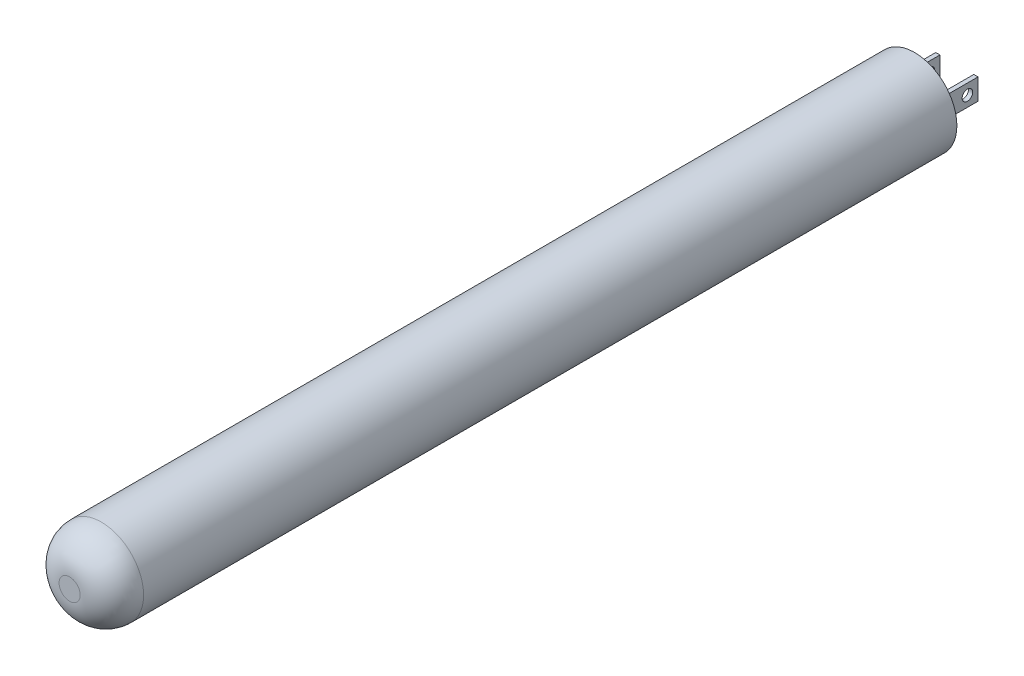
ISO-10303-21;
HEADER;
FILE_DESCRIPTION(('STEP AP214'),'2;1');
FILE_NAME('part.step','',(''),(''),'','','');
FILE_SCHEMA(('AUTOMOTIVE_DESIGN { 1 0 10303 214 1 1 1 1 }'));
ENDSEC;
DATA;
#1=APPLICATION_CONTEXT('core data for automotive mechanical design processes');
#2=APPLICATION_PROTOCOL_DEFINITION('international standard','automotive_design',2000,#1);
#3=PRODUCT_CONTEXT('',#1,'mechanical');
#4=PRODUCT('Part','Part','',(#3));
#5=PRODUCT_RELATED_PRODUCT_CATEGORY('part','',(#4));
#6=PRODUCT_DEFINITION_FORMATION('','',#4);
#7=PRODUCT_DEFINITION_CONTEXT('part definition',#1,'design');
#8=PRODUCT_DEFINITION('design','',#6,#7);
#9=PRODUCT_DEFINITION_SHAPE('','',#8);
#10=(LENGTH_UNIT() NAMED_UNIT(*) SI_UNIT(.MILLI.,.METRE.));
#11=(NAMED_UNIT(*) PLANE_ANGLE_UNIT() SI_UNIT($,.RADIAN.));
#12=(NAMED_UNIT(*) SI_UNIT($,.STERADIAN.) SOLID_ANGLE_UNIT());
#13=UNCERTAINTY_MEASURE_WITH_UNIT(LENGTH_MEASURE(1.E-05),#10,'distance_accuracy_value','');
#14=(GEOMETRIC_REPRESENTATION_CONTEXT(3) GLOBAL_UNCERTAINTY_ASSIGNED_CONTEXT((#13)) GLOBAL_UNIT_ASSIGNED_CONTEXT((#10,
#11,#12)) REPRESENTATION_CONTEXT('',''));
#15=CARTESIAN_POINT('',(0.,0.,0.));
#16=DIRECTION('',(0.,0.,1.));
#17=DIRECTION('',(1.,0.,0.));
#18=AXIS2_PLACEMENT_3D('',#15,#16,#17);
#19=CARTESIAN_POINT('',(0.,0.,-200.));
#20=DIRECTION('',(0.,0.,1.));
#21=DIRECTION('',(1.,0.,0.));
#22=AXIS2_PLACEMENT_3D('',#19,#20,#21);
#23=PLANE('',#22);
#24=DIRECTION('',(0.,1.,0.));
#25=VECTOR('',#24,1.);
#26=CARTESIAN_POINT('',(10.,0.,-200.));
#27=LINE('',#26,#25);
#28=CARTESIAN_POINT('',(10.,-5.,-200.));
#29=VERTEX_POINT('',#28);
#30=CARTESIAN_POINT('',(10.,5.,-200.));
#31=VERTEX_POINT('',#30);
#32=EDGE_CURVE('E51',#29,#31,#27,.T.);
#33=ORIENTED_EDGE('',*,*,#32,.T.);
#34=DIRECTION('',(-1.,0.,0.));
#35=VECTOR('',#34,1.);
#36=CARTESIAN_POINT('',(0.,4.99999999999999,-200.));
#37=LINE('',#36,#35);
#38=CARTESIAN_POINT('',(8.,5.,-200.));
#39=VERTEX_POINT('',#38);
#40=EDGE_CURVE('E133',#31,#39,#37,.T.);
#41=ORIENTED_EDGE('',*,*,#40,.T.);
#42=DIRECTION('',(0.,1.,0.));
#43=VECTOR('',#42,1.);
#44=CARTESIAN_POINT('',(8.,0.,-200.));
#45=LINE('',#44,#43);
#46=CARTESIAN_POINT('',(8.,-5.,-200.));
#47=VERTEX_POINT('',#46);
#48=EDGE_CURVE('E117',#47,#39,#45,.T.);
#49=ORIENTED_EDGE('',*,*,#48,.F.);
#50=DIRECTION('',(-1.,0.,0.));
#51=VECTOR('',#50,1.);
#52=CARTESIAN_POINT('',(0.,-5.00000000000001,-200.));
#53=LINE('',#52,#51);
#54=EDGE_CURVE('E56',#29,#47,#53,.T.);
#55=ORIENTED_EDGE('',*,*,#54,.F.);
#56=EDGE_LOOP('',(#33,#41,#49,#55));
#57=FACE_BOUND('',#56,.T.);
#58=CARTESIAN_POINT('',(0.,0.,-200.));
#59=DIRECTION('',(0.,0.,1.));
#60=DIRECTION('',(1.,0.,0.));
#61=AXIS2_PLACEMENT_3D('',#58,#59,#60);
#62=CIRCLE('',#61,20.);
#63=CARTESIAN_POINT('',(20.,0.,-200.));
#64=VERTEX_POINT('',#63);
#65=EDGE_CURVE('E173',#64,#64,#62,.T.);
#66=ORIENTED_EDGE('',*,*,#65,.F.);
#67=EDGE_LOOP('',(#66));
#68=FACE_BOUND('',#67,.T.);
#69=DIRECTION('',(1.,0.,0.));
#70=VECTOR('',#69,1.);
#71=CARTESIAN_POINT('',(0.,4.99999999999999,-200.));
#72=LINE('',#71,#70);
#73=CARTESIAN_POINT('',(-10.,4.99999999999999,-200.));
#74=VERTEX_POINT('',#73);
#75=CARTESIAN_POINT('',(-8.,4.99999999999999,-200.));
#76=VERTEX_POINT('',#75);
#77=EDGE_CURVE('E138',#74,#76,#72,.T.);
#78=ORIENTED_EDGE('',*,*,#77,.F.);
#79=DIRECTION('',(0.,1.,0.));
#80=VECTOR('',#79,1.);
#81=CARTESIAN_POINT('',(-10.,0.,-200.));
#82=LINE('',#81,#80);
#83=CARTESIAN_POINT('',(-10.,-5.,-200.));
#84=VERTEX_POINT('',#83);
#85=EDGE_CURVE('E145',#84,#74,#82,.T.);
#86=ORIENTED_EDGE('',*,*,#85,.F.);
#87=DIRECTION('',(1.,0.,0.));
#88=VECTOR('',#87,1.);
#89=CARTESIAN_POINT('',(0.,-5.,-200.));
#90=LINE('',#89,#88);
#91=CARTESIAN_POINT('',(-8.,-5.,-200.));
#92=VERTEX_POINT('',#91);
#93=EDGE_CURVE('E158',#84,#92,#90,.T.);
#94=ORIENTED_EDGE('',*,*,#93,.T.);
#95=DIRECTION('',(0.,1.,0.));
#96=VECTOR('',#95,1.);
#97=CARTESIAN_POINT('',(-8.,0.,-200.));
#98=LINE('',#97,#96);
#99=EDGE_CURVE('E156',#92,#76,#98,.T.);
#100=ORIENTED_EDGE('',*,*,#99,.T.);
#101=EDGE_LOOP('',(#78,#86,#94,#100));
#102=FACE_BOUND('',#101,.T.);
#103=ADVANCED_FACE('F35',(#57,#68,#102),#23,.F.);
#104=CARTESIAN_POINT('',(0.,0.,200.));
#105=DIRECTION('',(0.,0.,-1.));
#106=DIRECTION('',(-1.,0.,0.));
#107=AXIS2_PLACEMENT_3D('',#104,#105,#106);
#108=CYLINDRICAL_SURFACE('',#107,20.);
#109=CARTESIAN_POINT('',(0.,0.,185.));
#110=DIRECTION('',(0.,0.,1.));
#111=DIRECTION('',(1.,0.,0.));
#112=AXIS2_PLACEMENT_3D('',#109,#110,#111);
#113=CIRCLE('',#112,20.);
#114=CARTESIAN_POINT('',(20.,0.,185.));
#115=VERTEX_POINT('',#114);
#116=EDGE_CURVE('E11',#115,#115,#113,.F.);
#117=ORIENTED_EDGE('',*,*,#116,.T.);
#118=EDGE_LOOP('',(#117));
#119=FACE_BOUND('',#118,.T.);
#120=ORIENTED_EDGE('',*,*,#65,.T.);
#121=EDGE_LOOP('',(#120));
#122=FACE_BOUND('',#121,.T.);
#123=ADVANCED_FACE('F191',(#119,#122),#108,.T.);
#124=CARTESIAN_POINT('',(0.,0.,200.));
#125=DIRECTION('',(0.,0.,1.));
#126=DIRECTION('',(1.,0.,0.));
#127=AXIS2_PLACEMENT_3D('',#124,#125,#126);
#128=PLANE('',#127);
#129=CARTESIAN_POINT('',(0.,0.,200.));
#130=DIRECTION('',(0.,0.,1.));
#131=DIRECTION('',(1.,0.,0.));
#132=AXIS2_PLACEMENT_3D('',#129,#130,#131);
#133=CIRCLE('',#132,5.);
#134=CARTESIAN_POINT('',(5.,0.,200.));
#135=VERTEX_POINT('',#134);
#136=EDGE_CURVE('E44',#135,#135,#133,.T.);
#137=ORIENTED_EDGE('',*,*,#136,.T.);
#138=EDGE_LOOP('',(#137));
#139=FACE_BOUND('',#138,.T.);
#140=ADVANCED_FACE('F179',(#139),#128,.T.);
#141=CARTESIAN_POINT('',(0.,0.,185.));
#142=DIRECTION('',(0.,0.,1.));
#143=DIRECTION('',(1.,0.,0.));
#144=AXIS2_PLACEMENT_3D('',#141,#142,#143);
#145=DEGENERATE_TOROIDAL_SURFACE('',#144,5.,15.,.T.);
#146=ORIENTED_EDGE('',*,*,#116,.F.);
#147=EDGE_LOOP('',(#146));
#148=FACE_BOUND('',#147,.T.);
#149=ORIENTED_EDGE('',*,*,#136,.F.);
#150=EDGE_LOOP('',(#149));
#151=FACE_BOUND('',#150,.T.);
#152=ADVANCED_FACE('F37',(#148,#151),#145,.T.);
#153=CARTESIAN_POINT('',(0.,4.99999999999999,-220.));
#154=DIRECTION('',(0.,-1.,0.));
#155=DIRECTION('',(1.,0.,0.));
#156=AXIS2_PLACEMENT_3D('',#153,#154,#155);
#157=PLANE('',#156);
#158=ORIENTED_EDGE('',*,*,#77,.T.);
#159=DIRECTION('',(0.,0.,1.));
#160=VECTOR('',#159,1.);
#161=CARTESIAN_POINT('',(-8.,4.99999999999999,-220.));
#162=LINE('',#161,#160);
#163=CARTESIAN_POINT('',(-8.,4.99999999999999,-220.));
#164=VERTEX_POINT('',#163);
#165=EDGE_CURVE('E170',#164,#76,#162,.T.);
#166=ORIENTED_EDGE('',*,*,#165,.F.);
#167=DIRECTION('',(1.,0.,0.));
#168=VECTOR('',#167,1.);
#169=CARTESIAN_POINT('',(0.,4.99999999999999,-220.));
#170=LINE('',#169,#168);
#171=CARTESIAN_POINT('',(-10.,4.99999999999999,-220.));
#172=VERTEX_POINT('',#171);
#173=EDGE_CURVE('E142',#172,#164,#170,.T.);
#174=ORIENTED_EDGE('',*,*,#173,.F.);
#175=DIRECTION('',(0.,0.,1.));
#176=VECTOR('',#175,1.);
#177=CARTESIAN_POINT('',(-10.,4.99999999999999,-220.));
#178=LINE('',#177,#176);
#179=EDGE_CURVE('E153',#172,#74,#178,.T.);
#180=ORIENTED_EDGE('',*,*,#179,.T.);
#181=EDGE_LOOP('',(#158,#166,#174,#180));
#182=FACE_BOUND('',#181,.T.);
#183=ADVANCED_FACE('F182',(#182),#157,.F.);
#184=CARTESIAN_POINT('',(-8.,0.,-220.));
#185=DIRECTION('',(1.,0.,0.));
#186=DIRECTION('',(0.,0.,-1.));
#187=AXIS2_PLACEMENT_3D('',#184,#185,#186);
#188=PLANE('',#187);
#189=CARTESIAN_POINT('',(-8.,0.,-215.));
#190=DIRECTION('',(1.,0.,0.));
#191=DIRECTION('',(0.,0.,-1.));
#192=AXIS2_PLACEMENT_3D('',#189,#190,#191);
#193=CIRCLE('',#192,2.5);
#194=CARTESIAN_POINT('',(-8.,0.,-217.5));
#195=VERTEX_POINT('',#194);
#196=EDGE_CURVE('E128',#195,#195,#193,.T.);
#197=ORIENTED_EDGE('',*,*,#196,.F.);
#198=EDGE_LOOP('',(#197));
#199=FACE_BOUND('',#198,.T.);
#200=ORIENTED_EDGE('',*,*,#99,.F.);
#201=DIRECTION('',(0.,0.,1.));
#202=VECTOR('',#201,1.);
#203=CARTESIAN_POINT('',(-8.,-5.,-220.));
#204=LINE('',#203,#202);
#205=CARTESIAN_POINT('',(-8.,-5.,-220.));
#206=VERTEX_POINT('',#205);
#207=EDGE_CURVE('E167',#206,#92,#204,.T.);
#208=ORIENTED_EDGE('',*,*,#207,.F.);
#209=DIRECTION('',(0.,1.,0.));
#210=VECTOR('',#209,1.);
#211=CARTESIAN_POINT('',(-8.,0.,-220.));
#212=LINE('',#211,#210);
#213=EDGE_CURVE('E144',#206,#164,#212,.T.);
#214=ORIENTED_EDGE('',*,*,#213,.T.);
#215=ORIENTED_EDGE('',*,*,#165,.T.);
#216=EDGE_LOOP('',(#200,#208,#214,#215));
#217=FACE_BOUND('',#216,.T.);
#218=ADVANCED_FACE('F188',(#199,#217),#188,.T.);
#219=CARTESIAN_POINT('',(0.,-5.,-220.));
#220=DIRECTION('',(0.,-1.,0.));
#221=DIRECTION('',(1.,0.,0.));
#222=AXIS2_PLACEMENT_3D('',#219,#220,#221);
#223=PLANE('',#222);
#224=ORIENTED_EDGE('',*,*,#93,.F.);
#225=DIRECTION('',(0.,0.,1.));
#226=VECTOR('',#225,1.);
#227=CARTESIAN_POINT('',(-10.,-5.,-220.));
#228=LINE('',#227,#226);
#229=CARTESIAN_POINT('',(-10.,-5.,-220.));
#230=VERTEX_POINT('',#229);
#231=EDGE_CURVE('E164',#230,#84,#228,.T.);
#232=ORIENTED_EDGE('',*,*,#231,.F.);
#233=DIRECTION('',(1.,0.,0.));
#234=VECTOR('',#233,1.);
#235=CARTESIAN_POINT('',(0.,-5.,-220.));
#236=LINE('',#235,#234);
#237=EDGE_CURVE('E148',#230,#206,#236,.T.);
#238=ORIENTED_EDGE('',*,*,#237,.T.);
#239=ORIENTED_EDGE('',*,*,#207,.T.);
#240=EDGE_LOOP('',(#224,#232,#238,#239));
#241=FACE_BOUND('',#240,.T.);
#242=ADVANCED_FACE('F204',(#241),#223,.T.);
#243=CARTESIAN_POINT('',(-10.,0.,-220.));
#244=DIRECTION('',(1.,0.,0.));
#245=DIRECTION('',(0.,0.,-1.));
#246=AXIS2_PLACEMENT_3D('',#243,#244,#245);
#247=PLANE('',#246);
#248=CARTESIAN_POINT('',(-10.,0.,-215.));
#249=DIRECTION('',(1.,0.,0.));
#250=DIRECTION('',(0.,0.,-1.));
#251=AXIS2_PLACEMENT_3D('',#248,#249,#250);
#252=CIRCLE('',#251,2.5);
#253=CARTESIAN_POINT('',(-10.,0.,-217.5));
#254=VERTEX_POINT('',#253);
#255=EDGE_CURVE('E245',#254,#254,#252,.T.);
#256=ORIENTED_EDGE('',*,*,#255,.T.);
#257=EDGE_LOOP('',(#256));
#258=FACE_BOUND('',#257,.T.);
#259=ORIENTED_EDGE('',*,*,#85,.T.);
#260=ORIENTED_EDGE('',*,*,#179,.F.);
#261=DIRECTION('',(0.,1.,0.));
#262=VECTOR('',#261,1.);
#263=CARTESIAN_POINT('',(-10.,0.,-220.));
#264=LINE('',#263,#262);
#265=EDGE_CURVE('E151',#230,#172,#264,.T.);
#266=ORIENTED_EDGE('',*,*,#265,.F.);
#267=ORIENTED_EDGE('',*,*,#231,.T.);
#268=EDGE_LOOP('',(#259,#260,#266,#267));
#269=FACE_BOUND('',#268,.T.);
#270=ADVANCED_FACE('F208',(#258,#269),#247,.F.);
#271=CARTESIAN_POINT('',(0.,0.,-220.));
#272=DIRECTION('',(0.,0.,1.));
#273=DIRECTION('',(1.,0.,0.));
#274=AXIS2_PLACEMENT_3D('',#271,#272,#273);
#275=PLANE('',#274);
#276=ORIENTED_EDGE('',*,*,#173,.T.);
#277=ORIENTED_EDGE('',*,*,#213,.F.);
#278=ORIENTED_EDGE('',*,*,#237,.F.);
#279=ORIENTED_EDGE('',*,*,#265,.T.);
#280=EDGE_LOOP('',(#276,#277,#278,#279));
#281=FACE_BOUND('',#280,.T.);
#282=ADVANCED_FACE('F212',(#281),#275,.F.);
#283=CARTESIAN_POINT('',(0.,4.99999999999999,-220.));
#284=DIRECTION('',(0.,1.,0.));
#285=DIRECTION('',(-1.,0.,0.));
#286=AXIS2_PLACEMENT_3D('',#283,#284,#285);
#287=PLANE('',#286);
#288=ORIENTED_EDGE('',*,*,#40,.F.);
#289=DIRECTION('',(0.,0.,1.));
#290=VECTOR('',#289,1.);
#291=CARTESIAN_POINT('',(10.,5.,-220.));
#292=LINE('',#291,#290);
#293=CARTESIAN_POINT('',(10.,5.,-220.));
#294=VERTEX_POINT('',#293);
#295=EDGE_CURVE('E124',#294,#31,#292,.T.);
#296=ORIENTED_EDGE('',*,*,#295,.F.);
#297=DIRECTION('',(-1.,0.,0.));
#298=VECTOR('',#297,1.);
#299=CARTESIAN_POINT('',(0.,4.99999999999999,-220.));
#300=LINE('',#299,#298);
#301=CARTESIAN_POINT('',(8.,5.,-220.));
#302=VERTEX_POINT('',#301);
#303=EDGE_CURVE('E105',#294,#302,#300,.T.);
#304=ORIENTED_EDGE('',*,*,#303,.T.);
#305=DIRECTION('',(0.,0.,1.));
#306=VECTOR('',#305,1.);
#307=CARTESIAN_POINT('',(8.,5.,-220.));
#308=LINE('',#307,#306);
#309=EDGE_CURVE('E115',#302,#39,#308,.T.);
#310=ORIENTED_EDGE('',*,*,#309,.T.);
#311=EDGE_LOOP('',(#288,#296,#304,#310));
#312=FACE_BOUND('',#311,.T.);
#313=ADVANCED_FACE('F123',(#312),#287,.T.);
#314=CARTESIAN_POINT('',(10.,0.,-220.));
#315=DIRECTION('',(1.,0.,0.));
#316=DIRECTION('',(0.,0.,-1.));
#317=AXIS2_PLACEMENT_3D('',#314,#315,#316);
#318=PLANE('',#317);
#319=CARTESIAN_POINT('',(10.,0.,-215.));
#320=DIRECTION('',(1.,0.,0.));
#321=DIRECTION('',(0.,0.,-1.));
#322=AXIS2_PLACEMENT_3D('',#319,#320,#321);
#323=CIRCLE('',#322,2.5);
#324=CARTESIAN_POINT('',(10.,0.,-217.5));
#325=VERTEX_POINT('',#324);
#326=EDGE_CURVE('E246',#325,#325,#323,.T.);
#327=ORIENTED_EDGE('',*,*,#326,.F.);
#328=EDGE_LOOP('',(#327));
#329=FACE_BOUND('',#328,.T.);
#330=ORIENTED_EDGE('',*,*,#32,.F.);
#331=DIRECTION('',(0.,0.,1.));
#332=VECTOR('',#331,1.);
#333=CARTESIAN_POINT('',(10.,-5.,-220.));
#334=LINE('',#333,#332);
#335=CARTESIAN_POINT('',(10.,-5.,-220.));
#336=VERTEX_POINT('',#335);
#337=EDGE_CURVE('E139',#336,#29,#334,.T.);
#338=ORIENTED_EDGE('',*,*,#337,.F.);
#339=DIRECTION('',(0.,1.,0.));
#340=VECTOR('',#339,1.);
#341=CARTESIAN_POINT('',(10.,0.,-220.));
#342=LINE('',#341,#340);
#343=EDGE_CURVE('E121',#336,#294,#342,.T.);
#344=ORIENTED_EDGE('',*,*,#343,.T.);
#345=ORIENTED_EDGE('',*,*,#295,.T.);
#346=EDGE_LOOP('',(#330,#338,#344,#345));
#347=FACE_BOUND('',#346,.T.);
#348=ADVANCED_FACE('F219',(#329,#347),#318,.T.);
#349=CARTESIAN_POINT('',(0.,-5.00000000000001,-220.));
#350=DIRECTION('',(0.,1.,0.));
#351=DIRECTION('',(-1.,0.,0.));
#352=AXIS2_PLACEMENT_3D('',#349,#350,#351);
#353=PLANE('',#352);
#354=ORIENTED_EDGE('',*,*,#54,.T.);
#355=DIRECTION('',(0.,0.,1.));
#356=VECTOR('',#355,1.);
#357=CARTESIAN_POINT('',(8.,-5.,-220.));
#358=LINE('',#357,#356);
#359=CARTESIAN_POINT('',(8.,-5.,-220.));
#360=VERTEX_POINT('',#359);
#361=EDGE_CURVE('E120',#360,#47,#358,.T.);
#362=ORIENTED_EDGE('',*,*,#361,.F.);
#363=DIRECTION('',(-1.,0.,0.));
#364=VECTOR('',#363,1.);
#365=CARTESIAN_POINT('',(0.,-5.00000000000001,-220.));
#366=LINE('',#365,#364);
#367=EDGE_CURVE('E108',#336,#360,#366,.T.);
#368=ORIENTED_EDGE('',*,*,#367,.F.);
#369=ORIENTED_EDGE('',*,*,#337,.T.);
#370=EDGE_LOOP('',(#354,#362,#368,#369));
#371=FACE_BOUND('',#370,.T.);
#372=ADVANCED_FACE('F222',(#371),#353,.F.);
#373=CARTESIAN_POINT('',(8.,0.,-220.));
#374=DIRECTION('',(1.,0.,0.));
#375=DIRECTION('',(0.,0.,-1.));
#376=AXIS2_PLACEMENT_3D('',#373,#374,#375);
#377=PLANE('',#376);
#378=CARTESIAN_POINT('',(8.,0.,-215.));
#379=DIRECTION('',(1.,0.,0.));
#380=DIRECTION('',(0.,0.,-1.));
#381=AXIS2_PLACEMENT_3D('',#378,#379,#380);
#382=CIRCLE('',#381,2.5);
#383=CARTESIAN_POINT('',(8.,0.,-217.5));
#384=VERTEX_POINT('',#383);
#385=EDGE_CURVE('E39',#384,#384,#382,.T.);
#386=ORIENTED_EDGE('',*,*,#385,.T.);
#387=EDGE_LOOP('',(#386));
#388=FACE_BOUND('',#387,.T.);
#389=ORIENTED_EDGE('',*,*,#48,.T.);
#390=ORIENTED_EDGE('',*,*,#309,.F.);
#391=DIRECTION('',(0.,1.,0.));
#392=VECTOR('',#391,1.);
#393=CARTESIAN_POINT('',(8.,0.,-220.));
#394=LINE('',#393,#392);
#395=EDGE_CURVE('E100',#360,#302,#394,.T.);
#396=ORIENTED_EDGE('',*,*,#395,.F.);
#397=ORIENTED_EDGE('',*,*,#361,.T.);
#398=EDGE_LOOP('',(#389,#390,#396,#397));
#399=FACE_BOUND('',#398,.T.);
#400=ADVANCED_FACE('F116',(#388,#399),#377,.F.);
#401=CARTESIAN_POINT('',(0.,0.,-220.));
#402=DIRECTION('',(0.,0.,-1.));
#403=DIRECTION('',(-1.,0.,0.));
#404=AXIS2_PLACEMENT_3D('',#401,#402,#403);
#405=PLANE('',#404);
#406=ORIENTED_EDGE('',*,*,#303,.F.);
#407=ORIENTED_EDGE('',*,*,#343,.F.);
#408=ORIENTED_EDGE('',*,*,#367,.T.);
#409=ORIENTED_EDGE('',*,*,#395,.T.);
#410=EDGE_LOOP('',(#406,#407,#408,#409));
#411=FACE_BOUND('',#410,.T.);
#412=ADVANCED_FACE('F102',(#411),#405,.T.);
#413=CARTESIAN_POINT('',(-11.,0.,-215.));
#414=DIRECTION('',(1.,0.,0.));
#415=DIRECTION('',(0.,0.,-1.));
#416=AXIS2_PLACEMENT_3D('',#413,#414,#415);
#417=CYLINDRICAL_SURFACE('',#416,2.5);
#418=ORIENTED_EDGE('',*,*,#326,.T.);
#419=EDGE_LOOP('',(#418));
#420=FACE_BOUND('',#419,.T.);
#421=ORIENTED_EDGE('',*,*,#385,.F.);
#422=EDGE_LOOP('',(#421));
#423=FACE_BOUND('',#422,.T.);
#424=ADVANCED_FACE('F232',(#420,#423),#417,.F.);
#425=ORIENTED_EDGE('',*,*,#196,.T.);
#426=EDGE_LOOP('',(#425));
#427=FACE_BOUND('',#426,.T.);
#428=ORIENTED_EDGE('',*,*,#255,.F.);
#429=EDGE_LOOP('',(#428));
#430=FACE_BOUND('',#429,.T.);
#431=ADVANCED_FACE('F233',(#427,#430),#417,.F.);
#432=CLOSED_SHELL('',(#103,#123,#140,#152,#183,#218,#242,#270,#282,#313,#348,#372,#400,#412,
#424,#431));
#433=MANIFOLD_SOLID_BREP('B2',#432);
#434=ADVANCED_BREP_SHAPE_REPRESENTATION('',(#18,#433),#14);
#435=SHAPE_DEFINITION_REPRESENTATION(#9,#434);
ENDSEC;
END-ISO-10303-21;
